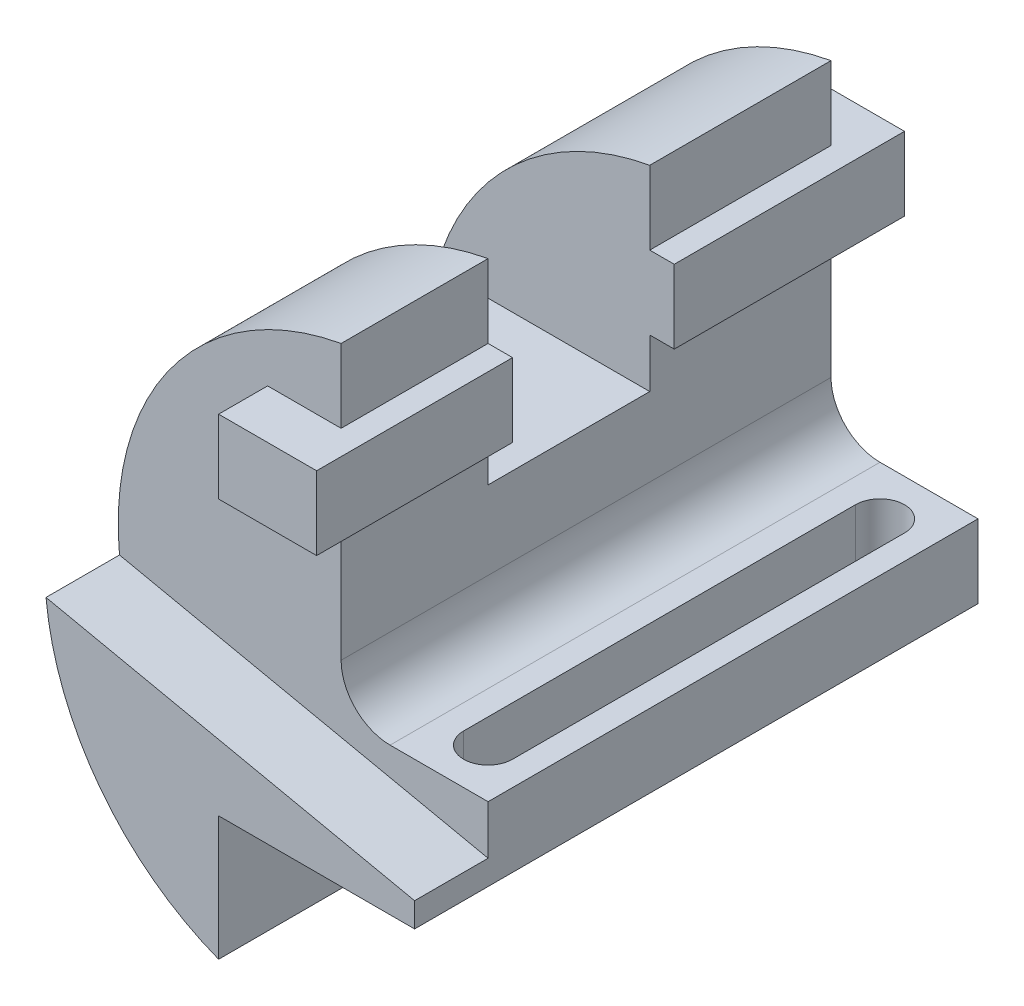
ISO-10303-21;
HEADER;
FILE_DESCRIPTION(('STEP AP214'),'2;1');
FILE_NAME('part.step','',(''),(''),'','','');
FILE_SCHEMA(('AUTOMOTIVE_DESIGN { 1 0 10303 214 1 1 1 1 }'));
ENDSEC;
DATA;
#1=APPLICATION_CONTEXT('core data for automotive mechanical design processes');
#2=APPLICATION_PROTOCOL_DEFINITION('international standard','automotive_design',2000,#1);
#3=PRODUCT_CONTEXT('',#1,'mechanical');
#4=PRODUCT('Part','Part','',(#3));
#5=PRODUCT_RELATED_PRODUCT_CATEGORY('part','',(#4));
#6=PRODUCT_DEFINITION_FORMATION('','',#4);
#7=PRODUCT_DEFINITION_CONTEXT('part definition',#1,'design');
#8=PRODUCT_DEFINITION('design','',#6,#7);
#9=PRODUCT_DEFINITION_SHAPE('','',#8);
#10=(LENGTH_UNIT() NAMED_UNIT(*) SI_UNIT(.MILLI.,.METRE.));
#11=(NAMED_UNIT(*) PLANE_ANGLE_UNIT() SI_UNIT($,.RADIAN.));
#12=(NAMED_UNIT(*) SI_UNIT($,.STERADIAN.) SOLID_ANGLE_UNIT());
#13=UNCERTAINTY_MEASURE_WITH_UNIT(LENGTH_MEASURE(1.E-05),#10,'distance_accuracy_value','');
#14=(GEOMETRIC_REPRESENTATION_CONTEXT(3) GLOBAL_UNCERTAINTY_ASSIGNED_CONTEXT((#13)) GLOBAL_UNIT_ASSIGNED_CONTEXT((#10,
#11,#12)) REPRESENTATION_CONTEXT('',''));
#15=CARTESIAN_POINT('',(0.,0.,0.));
#16=DIRECTION('',(0.,0.,1.));
#17=DIRECTION('',(1.,0.,0.));
#18=AXIS2_PLACEMENT_3D('',#15,#16,#17);
#19=CARTESIAN_POINT('',(-30.,15.,115.));
#20=DIRECTION('',(-1.,0.,0.));
#21=DIRECTION('',(0.,0.,1.));
#22=AXIS2_PLACEMENT_3D('',#19,#20,#21);
#23=PLANE('',#22);
#24=DIRECTION('',(0.,0.,1.));
#25=VECTOR('',#24,1.);
#26=CARTESIAN_POINT('',(-30.,66.,115.));
#27=LINE('',#26,#25);
#28=CARTESIAN_POINT('',(-30.,66.,70.));
#29=VERTEX_POINT('',#28);
#30=CARTESIAN_POINT('',(-30.,66.,100.));
#31=VERTEX_POINT('',#30);
#32=EDGE_CURVE('E333',#29,#31,#27,.T.);
#33=ORIENTED_EDGE('',*,*,#32,.F.);
#34=DIRECTION('',(0.,1.,0.));
#35=VECTOR('',#34,1.);
#36=CARTESIAN_POINT('',(-30.,15.,70.));
#37=LINE('',#36,#35);
#38=CARTESIAN_POINT('',(-30.,81.,70.));
#39=VERTEX_POINT('',#38);
#40=EDGE_CURVE('E284',#29,#39,#37,.T.);
#41=ORIENTED_EDGE('',*,*,#40,.T.);
#42=DIRECTION('',(0.,0.,-1.));
#43=VECTOR('',#42,1.);
#44=CARTESIAN_POINT('',(-30.,81.,115.));
#45=LINE('',#44,#43);
#46=CARTESIAN_POINT('',(-30.,81.,100.));
#47=VERTEX_POINT('',#46);
#48=EDGE_CURVE('E399',#47,#39,#45,.T.);
#49=ORIENTED_EDGE('',*,*,#48,.F.);
#50=DIRECTION('',(0.,1.,0.));
#51=VECTOR('',#50,1.);
#52=CARTESIAN_POINT('',(-30.,15.,100.));
#53=LINE('',#52,#51);
#54=EDGE_CURVE('E352',#31,#47,#53,.T.);
#55=ORIENTED_EDGE('',*,*,#54,.F.);
#56=EDGE_LOOP('',(#33,#41,#49,#55));
#57=FACE_BOUND('',#56,.T.);
#58=ADVANCED_FACE('F38',(#57),#23,.F.);
#59=CARTESIAN_POINT('',(-25.,51.,-10.));
#60=DIRECTION('',(0.,1.,0.));
#61=DIRECTION('',(0.,0.,1.));
#62=AXIS2_PLACEMENT_3D('',#59,#60,#61);
#63=PLANE('',#62);
#64=DIRECTION('',(0.,0.,-1.));
#65=VECTOR('',#64,1.);
#66=CARTESIAN_POINT('',(-30.,51.,115.));
#67=LINE('',#66,#65);
#68=CARTESIAN_POINT('',(-30.,51.,100.));
#69=VERTEX_POINT('',#68);
#70=CARTESIAN_POINT('',(-30.,51.,70.));
#71=VERTEX_POINT('',#70);
#72=EDGE_CURVE('E342',#69,#71,#67,.T.);
#73=ORIENTED_EDGE('',*,*,#72,.T.);
#74=DIRECTION('',(1.,0.,0.));
#75=VECTOR('',#74,1.);
#76=CARTESIAN_POINT('',(-25.,51.,70.));
#77=LINE('',#76,#75);
#78=CARTESIAN_POINT('',(-25.,51.,70.));
#79=VERTEX_POINT('',#78);
#80=EDGE_CURVE('E281',#71,#79,#77,.T.);
#81=ORIENTED_EDGE('',*,*,#80,.T.);
#82=DIRECTION('',(0.,0.,1.));
#83=VECTOR('',#82,1.);
#84=CARTESIAN_POINT('',(-25.,51.,-10.));
#85=LINE('',#84,#83);
#86=CARTESIAN_POINT('',(-25.,51.,110.));
#87=VERTEX_POINT('',#86);
#88=EDGE_CURVE('E329',#79,#87,#85,.T.);
#89=ORIENTED_EDGE('',*,*,#88,.T.);
#90=DIRECTION('',(-1.,0.,0.));
#91=VECTOR('',#90,1.);
#92=CARTESIAN_POINT('',(-25.,51.,110.));
#93=LINE('',#92,#91);
#94=CARTESIAN_POINT('',(-45.,51.,110.));
#95=VERTEX_POINT('',#94);
#96=EDGE_CURVE('E296',#87,#95,#93,.T.);
#97=ORIENTED_EDGE('',*,*,#96,.T.);
#98=DIRECTION('',(0.,0.,1.));
#99=VECTOR('',#98,1.);
#100=CARTESIAN_POINT('',(-45.,51.,-10.));
#101=LINE('',#100,#99);
#102=CARTESIAN_POINT('',(-45.,51.,100.));
#103=VERTEX_POINT('',#102);
#104=EDGE_CURVE('E325',#103,#95,#101,.T.);
#105=ORIENTED_EDGE('',*,*,#104,.F.);
#106=DIRECTION('',(-1.,0.,0.));
#107=VECTOR('',#106,1.);
#108=CARTESIAN_POINT('',(-20.,51.,100.));
#109=LINE('',#108,#107);
#110=EDGE_CURVE('E410',#69,#103,#109,.T.);
#111=ORIENTED_EDGE('',*,*,#110,.F.);
#112=EDGE_LOOP('',(#73,#81,#89,#97,#105,#111));
#113=FACE_BOUND('',#112,.T.);
#114=ADVANCED_FACE('F515',(#113),#63,.F.);
#115=CARTESIAN_POINT('',(-25.,66.,-10.));
#116=DIRECTION('',(0.,-1.,0.));
#117=DIRECTION('',(0.,0.,-1.));
#118=AXIS2_PLACEMENT_3D('',#115,#116,#117);
#119=PLANE('',#118);
#120=DIRECTION('',(0.,0.,1.));
#121=VECTOR('',#120,1.);
#122=CARTESIAN_POINT('',(-25.,66.,-10.));
#123=LINE('',#122,#121);
#124=CARTESIAN_POINT('',(-25.,66.,70.));
#125=VERTEX_POINT('',#124);
#126=CARTESIAN_POINT('',(-25.,66.,110.));
#127=VERTEX_POINT('',#126);
#128=EDGE_CURVE('E317',#125,#127,#123,.T.);
#129=ORIENTED_EDGE('',*,*,#128,.F.);
#130=DIRECTION('',(-1.,0.,0.));
#131=VECTOR('',#130,1.);
#132=CARTESIAN_POINT('',(-25.,66.,70.));
#133=LINE('',#132,#131);
#134=EDGE_CURVE('E278',#125,#29,#133,.T.);
#135=ORIENTED_EDGE('',*,*,#134,.T.);
#136=ORIENTED_EDGE('',*,*,#32,.T.);
#137=DIRECTION('',(1.,0.,0.));
#138=VECTOR('',#137,1.);
#139=CARTESIAN_POINT('',(-20.,66.,100.));
#140=LINE('',#139,#138);
#141=CARTESIAN_POINT('',(-45.,66.,100.));
#142=VERTEX_POINT('',#141);
#143=EDGE_CURVE('E404',#142,#31,#140,.T.);
#144=ORIENTED_EDGE('',*,*,#143,.F.);
#145=DIRECTION('',(0.,0.,1.));
#146=VECTOR('',#145,1.);
#147=CARTESIAN_POINT('',(-45.,66.,-10.));
#148=LINE('',#147,#146);
#149=CARTESIAN_POINT('',(-45.,66.,110.));
#150=VERTEX_POINT('',#149);
#151=EDGE_CURVE('E321',#142,#150,#148,.T.);
#152=ORIENTED_EDGE('',*,*,#151,.T.);
#153=DIRECTION('',(1.,0.,0.));
#154=VECTOR('',#153,1.);
#155=CARTESIAN_POINT('',(-25.,66.,110.));
#156=LINE('',#155,#154);
#157=EDGE_CURVE('E304',#150,#127,#156,.T.);
#158=ORIENTED_EDGE('',*,*,#157,.T.);
#159=EDGE_LOOP('',(#129,#135,#136,#144,#152,#158));
#160=FACE_BOUND('',#159,.T.);
#161=ADVANCED_FACE('F521',(#160),#119,.F.);
#162=CARTESIAN_POINT('',(-25.,66.,-10.));
#163=DIRECTION('',(-1.,0.,0.));
#164=DIRECTION('',(0.,0.,1.));
#165=AXIS2_PLACEMENT_3D('',#162,#163,#164);
#166=PLANE('',#165);
#167=ORIENTED_EDGE('',*,*,#88,.F.);
#168=DIRECTION('',(0.,1.,0.));
#169=VECTOR('',#168,1.);
#170=CARTESIAN_POINT('',(-25.,66.,70.));
#171=LINE('',#170,#169);
#172=EDGE_CURVE('E416',#79,#125,#171,.T.);
#173=ORIENTED_EDGE('',*,*,#172,.T.);
#174=ORIENTED_EDGE('',*,*,#128,.T.);
#175=DIRECTION('',(0.,-1.,0.));
#176=VECTOR('',#175,1.);
#177=CARTESIAN_POINT('',(-25.,66.,110.));
#178=LINE('',#177,#176);
#179=EDGE_CURVE('E300',#127,#87,#178,.T.);
#180=ORIENTED_EDGE('',*,*,#179,.T.);
#181=EDGE_LOOP('',(#167,#173,#174,#180));
#182=FACE_BOUND('',#181,.T.);
#183=ADVANCED_FACE('F529',(#182),#166,.F.);
#184=CARTESIAN_POINT('',(-30.,25.,100.));
#185=VERTEX_POINT('',#184);
#186=EDGE_CURVE('E353',#185,#69,#53,.T.);
#187=ORIENTED_EDGE('',*,*,#186,.F.);
#188=DIRECTION('',(0.,0.,-1.));
#189=VECTOR('',#188,1.);
#190=CARTESIAN_POINT('',(-30.,25.,0.));
#191=LINE('',#190,#189);
#192=CARTESIAN_POINT('',(-30.,25.,0.));
#193=VERTEX_POINT('',#192);
#194=EDGE_CURVE('E431',#185,#193,#191,.T.);
#195=ORIENTED_EDGE('',*,*,#194,.T.);
#196=DIRECTION('',(0.,1.,0.));
#197=VECTOR('',#196,1.);
#198=CARTESIAN_POINT('',(-30.,15.,0.));
#199=LINE('',#198,#197);
#200=CARTESIAN_POINT('',(-30.,51.,0.));
#201=VERTEX_POINT('',#200);
#202=EDGE_CURVE('E383',#193,#201,#199,.T.);
#203=ORIENTED_EDGE('',*,*,#202,.T.);
#204=CARTESIAN_POINT('',(-30.,51.,37.));
#205=VERTEX_POINT('',#204);
#206=EDGE_CURVE('E341',#205,#201,#67,.T.);
#207=ORIENTED_EDGE('',*,*,#206,.F.);
#208=DIRECTION('',(0.,-1.,0.));
#209=VECTOR('',#208,1.);
#210=CARTESIAN_POINT('',(-30.,15.,37.));
#211=LINE('',#210,#209);
#212=CARTESIAN_POINT('',(-30.,41.,37.));
#213=VERTEX_POINT('',#212);
#214=EDGE_CURVE('E272',#205,#213,#211,.T.);
#215=ORIENTED_EDGE('',*,*,#214,.T.);
#216=DIRECTION('',(0.,0.,1.));
#217=VECTOR('',#216,1.);
#218=CARTESIAN_POINT('',(-30.,41.,115.));
#219=LINE('',#218,#217);
#220=CARTESIAN_POINT('',(-30.,41.,70.));
#221=VERTEX_POINT('',#220);
#222=EDGE_CURVE('E293',#213,#221,#219,.T.);
#223=ORIENTED_EDGE('',*,*,#222,.T.);
#224=DIRECTION('',(0.,1.,0.));
#225=VECTOR('',#224,1.);
#226=CARTESIAN_POINT('',(-30.,15.,70.));
#227=LINE('',#226,#225);
#228=EDGE_CURVE('E287',#221,#71,#227,.T.);
#229=ORIENTED_EDGE('',*,*,#228,.T.);
#230=ORIENTED_EDGE('',*,*,#72,.F.);
#231=EDGE_LOOP('',(#187,#195,#203,#207,#215,#223,#229,#230));
#232=FACE_BOUND('',#231,.T.);
#233=ADVANCED_FACE('F437',(#232),#23,.F.);
#234=CARTESIAN_POINT('',(-30.,81.,37.));
#235=VERTEX_POINT('',#234);
#236=CARTESIAN_POINT('',(-30.,81.,0.));
#237=VERTEX_POINT('',#236);
#238=EDGE_CURVE('E398',#235,#237,#45,.T.);
#239=ORIENTED_EDGE('',*,*,#238,.F.);
#240=DIRECTION('',(0.,-1.,0.));
#241=VECTOR('',#240,1.);
#242=CARTESIAN_POINT('',(-30.,15.,37.));
#243=LINE('',#242,#241);
#244=CARTESIAN_POINT('',(-30.,66.,37.));
#245=VERTEX_POINT('',#244);
#246=EDGE_CURVE('E269',#235,#245,#243,.T.);
#247=ORIENTED_EDGE('',*,*,#246,.T.);
#248=CARTESIAN_POINT('',(-30.,66.,0.));
#249=VERTEX_POINT('',#248);
#250=EDGE_CURVE('E334',#249,#245,#27,.T.);
#251=ORIENTED_EDGE('',*,*,#250,.F.);
#252=EDGE_CURVE('E382',#249,#237,#199,.T.);
#253=ORIENTED_EDGE('',*,*,#252,.T.);
#254=EDGE_LOOP('',(#239,#247,#251,#253));
#255=FACE_BOUND('',#254,.T.);
#256=ADVANCED_FACE('F471',(#255),#23,.F.);
#257=CARTESIAN_POINT('',(-20.,26.4083339693685,0.));
#258=DIRECTION('',(0.,0.,1.));
#259=DIRECTION('',(1.,0.,0.));
#260=AXIS2_PLACEMENT_3D('',#257,#258,#259);
#261=PLANE('',#260);
#262=DIRECTION('',(-1.,0.,0.));
#263=VECTOR('',#262,1.);
#264=CARTESIAN_POINT('',(-20.,51.,0.));
#265=LINE('',#264,#263);
#266=CARTESIAN_POINT('',(-45.,51.,0.));
#267=VERTEX_POINT('',#266);
#268=EDGE_CURVE('E345',#201,#267,#265,.T.);
#269=ORIENTED_EDGE('',*,*,#268,.F.);
#270=ORIENTED_EDGE('',*,*,#202,.F.);
#271=CARTESIAN_POINT('',(-20.,25.,0.));
#272=DIRECTION('',(0.,0.,1.));
#273=DIRECTION('',(1.,0.,0.));
#274=AXIS2_PLACEMENT_3D('',#271,#272,#273);
#275=CIRCLE('',#274,10.);
#276=CARTESIAN_POINT('',(-20.,15.,0.));
#277=VERTEX_POINT('',#276);
#278=EDGE_CURVE('E46',#193,#277,#275,.T.);
#279=ORIENTED_EDGE('',*,*,#278,.T.);
#280=DIRECTION('',(-1.,0.,0.));
#281=VECTOR('',#280,1.);
#282=CARTESIAN_POINT('',(0.,15.,0.));
#283=LINE('',#282,#281);
#284=CARTESIAN_POINT('',(0.,15.,0.));
#285=VERTEX_POINT('',#284);
#286=EDGE_CURVE('E380',#285,#277,#283,.T.);
#287=ORIENTED_EDGE('',*,*,#286,.F.);
#288=DIRECTION('',(0.,1.,0.));
#289=VECTOR('',#288,1.);
#290=CARTESIAN_POINT('',(0.,0.,0.));
#291=LINE('',#290,#289);
#292=CARTESIAN_POINT('',(0.,0.,0.));
#293=VERTEX_POINT('',#292);
#294=EDGE_CURVE('E365',#293,#285,#291,.T.);
#295=ORIENTED_EDGE('',*,*,#294,.F.);
#296=DIRECTION('',(1.,0.,0.));
#297=VECTOR('',#296,1.);
#298=CARTESIAN_POINT('',(0.,0.,0.));
#299=LINE('',#298,#297);
#300=CARTESIAN_POINT('',(-40.,0.,0.));
#301=VERTEX_POINT('',#300);
#302=EDGE_CURVE('E371',#301,#293,#299,.T.);
#303=ORIENTED_EDGE('',*,*,#302,.F.);
#304=DIRECTION('',(0.,1.,0.));
#305=VECTOR('',#304,1.);
#306=CARTESIAN_POINT('',(-40.,0.,0.));
#307=LINE('',#306,#305);
#308=CARTESIAN_POINT('',(-40.,-25.3627969821569,0.));
#309=VERTEX_POINT('',#308);
#310=EDGE_CURVE('E387',#309,#301,#307,.T.);
#311=ORIENTED_EDGE('',*,*,#310,.F.);
#312=CARTESIAN_POINT('',(-20.,26.4083339693685,0.));
#313=DIRECTION('',(0.,0.,1.));
#314=DIRECTION('',(1.,0.,0.));
#315=AXIS2_PLACEMENT_3D('',#312,#313,#314);
#316=CIRCLE('',#315,55.5);
#317=EDGE_CURVE('E385',#237,#309,#316,.T.);
#318=ORIENTED_EDGE('',*,*,#317,.F.);
#319=ORIENTED_EDGE('',*,*,#252,.F.);
#320=DIRECTION('',(1.,0.,0.));
#321=VECTOR('',#320,1.);
#322=CARTESIAN_POINT('',(-20.,66.,0.));
#323=LINE('',#322,#321);
#324=CARTESIAN_POINT('',(-45.,66.,0.));
#325=VERTEX_POINT('',#324);
#326=EDGE_CURVE('E337',#325,#249,#323,.T.);
#327=ORIENTED_EDGE('',*,*,#326,.F.);
#328=DIRECTION('',(0.,1.,0.));
#329=VECTOR('',#328,1.);
#330=CARTESIAN_POINT('',(-45.,26.4083339693685,0.));
#331=LINE('',#330,#329);
#332=EDGE_CURVE('E339',#267,#325,#331,.T.);
#333=ORIENTED_EDGE('',*,*,#332,.F.);
#334=EDGE_LOOP('',(#269,#270,#279,#287,#295,#303,#311,#318,#319,#327,#333));
#335=FACE_BOUND('',#334,.T.);
#336=ADVANCED_FACE('F444',(#335),#261,.F.);
#337=CARTESIAN_POINT('',(-20.,26.4083339693685,100.));
#338=DIRECTION('',(0.,0.,1.));
#339=DIRECTION('',(1.,0.,0.));
#340=AXIS2_PLACEMENT_3D('',#337,#338,#339);
#341=PLANE('',#340);
#342=DIRECTION('',(-1.,0.,0.));
#343=VECTOR('',#342,1.);
#344=CARTESIAN_POINT('',(0.,15.,100.));
#345=LINE('',#344,#343);
#346=CARTESIAN_POINT('',(0.,15.,100.));
#347=VERTEX_POINT('',#346);
#348=CARTESIAN_POINT('',(-20.,15.,100.));
#349=VERTEX_POINT('',#348);
#350=EDGE_CURVE('E350',#347,#349,#345,.T.);
#351=ORIENTED_EDGE('',*,*,#350,.T.);
#352=CARTESIAN_POINT('',(-20.,25.,100.));
#353=DIRECTION('',(0.,0.,1.));
#354=DIRECTION('',(1.,0.,0.));
#355=AXIS2_PLACEMENT_3D('',#352,#353,#354);
#356=CIRCLE('',#355,10.);
#357=EDGE_CURVE('E12',#349,#185,#356,.F.);
#358=ORIENTED_EDGE('',*,*,#357,.T.);
#359=ORIENTED_EDGE('',*,*,#186,.T.);
#360=ORIENTED_EDGE('',*,*,#110,.T.);
#361=DIRECTION('',(0.,1.,0.));
#362=VECTOR('',#361,1.);
#363=CARTESIAN_POINT('',(-45.,26.4083339693685,100.));
#364=LINE('',#363,#362);
#365=EDGE_CURVE('E407',#103,#142,#364,.T.);
#366=ORIENTED_EDGE('',*,*,#365,.T.);
#367=ORIENTED_EDGE('',*,*,#143,.T.);
#368=ORIENTED_EDGE('',*,*,#54,.T.);
#369=CARTESIAN_POINT('',(-20.,26.4083339693685,100.));
#370=DIRECTION('',(0.,0.,1.));
#371=DIRECTION('',(1.,0.,0.));
#372=AXIS2_PLACEMENT_3D('',#369,#370,#371);
#373=CIRCLE('',#372,55.5);
#374=CARTESIAN_POINT('',(-75.2350441418964,20.9917022998936,100.));
#375=VERTEX_POINT('',#374);
#376=EDGE_CURVE('E355',#47,#375,#373,.T.);
#377=ORIENTED_EDGE('',*,*,#376,.T.);
#378=DIRECTION('',(0.978147600733806,-0.207911690817756,0.));
#379=VECTOR('',#378,1.);
#380=CARTESIAN_POINT('',(0.,5.,100.));
#381=LINE('',#380,#379);
#382=CARTESIAN_POINT('',(0.,5.,100.));
#383=VERTEX_POINT('',#382);
#384=EDGE_CURVE('E357',#375,#383,#381,.T.);
#385=ORIENTED_EDGE('',*,*,#384,.T.);
#386=DIRECTION('',(0.,1.,0.));
#387=VECTOR('',#386,1.);
#388=CARTESIAN_POINT('',(0.,5.,100.));
#389=LINE('',#388,#387);
#390=EDGE_CURVE('E348',#383,#347,#389,.T.);
#391=ORIENTED_EDGE('',*,*,#390,.T.);
#392=EDGE_LOOP('',(#351,#358,#359,#360,#366,#367,#368,#377,#385,#391));
#393=FACE_BOUND('',#392,.T.);
#394=ADVANCED_FACE('F496',(#393),#341,.T.);
#395=CARTESIAN_POINT('',(0.,15.,115.));
#396=DIRECTION('',(0.,-1.,0.));
#397=DIRECTION('',(1.,0.,0.));
#398=AXIS2_PLACEMENT_3D('',#395,#396,#397);
#399=PLANE('',#398);
#400=DIRECTION('',(0.,0.,1.));
#401=VECTOR('',#400,1.);
#402=CARTESIAN_POINT('',(-15.,15.,10.));
#403=LINE('',#402,#401);
#404=CARTESIAN_POINT('',(-15.,15.,10.));
#405=VERTEX_POINT('',#404);
#406=CARTESIAN_POINT('',(-15.,15.,90.));
#407=VERTEX_POINT('',#406);
#408=EDGE_CURVE('E239',#405,#407,#403,.T.);
#409=ORIENTED_EDGE('',*,*,#408,.F.);
#410=CARTESIAN_POINT('',(-10.,15.,10.));
#411=DIRECTION('',(0.,1.,0.));
#412=DIRECTION('',(-1.,0.,0.));
#413=AXIS2_PLACEMENT_3D('',#410,#411,#412);
#414=CIRCLE('',#413,5.);
#415=CARTESIAN_POINT('',(-5.,15.,10.));
#416=VERTEX_POINT('',#415);
#417=EDGE_CURVE('E244',#416,#405,#414,.T.);
#418=ORIENTED_EDGE('',*,*,#417,.F.);
#419=DIRECTION('',(0.,0.,-1.));
#420=VECTOR('',#419,1.);
#421=CARTESIAN_POINT('',(-5.,15.,10.));
#422=LINE('',#421,#420);
#423=CARTESIAN_POINT('',(-4.99999999999999,15.,90.));
#424=VERTEX_POINT('',#423);
#425=EDGE_CURVE('E248',#424,#416,#422,.T.);
#426=ORIENTED_EDGE('',*,*,#425,.F.);
#427=CARTESIAN_POINT('',(-9.99999999999999,15.,90.));
#428=DIRECTION('',(0.,1.,0.));
#429=DIRECTION('',(-1.,0.,0.));
#430=AXIS2_PLACEMENT_3D('',#427,#428,#429);
#431=CIRCLE('',#430,5.);
#432=EDGE_CURVE('E228',#407,#424,#431,.T.);
#433=ORIENTED_EDGE('',*,*,#432,.F.);
#434=EDGE_LOOP('',(#409,#418,#426,#433));
#435=FACE_BOUND('',#434,.T.);
#436=ORIENTED_EDGE('',*,*,#286,.T.);
#437=DIRECTION('',(0.,0.,-1.));
#438=VECTOR('',#437,1.);
#439=CARTESIAN_POINT('',(-20.,15.,100.));
#440=LINE('',#439,#438);
#441=EDGE_CURVE('E59',#277,#349,#440,.F.);
#442=ORIENTED_EDGE('',*,*,#441,.T.);
#443=ORIENTED_EDGE('',*,*,#350,.F.);
#444=DIRECTION('',(0.,0.,-1.));
#445=VECTOR('',#444,1.);
#446=CARTESIAN_POINT('',(0.,15.,115.));
#447=LINE('',#446,#445);
#448=EDGE_CURVE('E402',#347,#285,#447,.T.);
#449=ORIENTED_EDGE('',*,*,#448,.T.);
#450=EDGE_LOOP('',(#436,#442,#443,#449));
#451=FACE_BOUND('',#450,.T.);
#452=ADVANCED_FACE('F246',(#435,#451),#399,.F.);
#453=CARTESIAN_POINT('',(0.,0.,115.));
#454=DIRECTION('',(-1.,0.,0.));
#455=DIRECTION('',(0.,0.,1.));
#456=AXIS2_PLACEMENT_3D('',#453,#454,#455);
#457=PLANE('',#456);
#458=ORIENTED_EDGE('',*,*,#390,.F.);
#459=DIRECTION('',(0.,0.,1.));
#460=VECTOR('',#459,1.);
#461=CARTESIAN_POINT('',(0.,5.,100.));
#462=LINE('',#461,#460);
#463=CARTESIAN_POINT('',(0.,5.,115.));
#464=VERTEX_POINT('',#463);
#465=EDGE_CURVE('E362',#383,#464,#462,.T.);
#466=ORIENTED_EDGE('',*,*,#465,.T.);
#467=DIRECTION('',(0.,1.,0.));
#468=VECTOR('',#467,1.);
#469=CARTESIAN_POINT('',(0.,0.,115.));
#470=LINE('',#469,#468);
#471=CARTESIAN_POINT('',(0.,0.,115.));
#472=VERTEX_POINT('',#471);
#473=EDGE_CURVE('E367',#472,#464,#470,.T.);
#474=ORIENTED_EDGE('',*,*,#473,.F.);
#475=DIRECTION('',(0.,0.,-1.));
#476=VECTOR('',#475,1.);
#477=CARTESIAN_POINT('',(0.,0.,115.));
#478=LINE('',#477,#476);
#479=EDGE_CURVE('E377',#472,#293,#478,.T.);
#480=ORIENTED_EDGE('',*,*,#479,.T.);
#481=ORIENTED_EDGE('',*,*,#294,.T.);
#482=ORIENTED_EDGE('',*,*,#448,.F.);
#483=EDGE_LOOP('',(#458,#466,#474,#480,#481,#482));
#484=FACE_BOUND('',#483,.T.);
#485=ADVANCED_FACE('F499',(#484),#457,.F.);
#486=CARTESIAN_POINT('',(-20.,26.4083339693685,115.));
#487=DIRECTION('',(0.,0.,-1.));
#488=DIRECTION('',(-1.,0.,0.));
#489=AXIS2_PLACEMENT_3D('',#486,#487,#488);
#490=CYLINDRICAL_SURFACE('',#489,55.5);
#491=ORIENTED_EDGE('',*,*,#48,.T.);
#492=CARTESIAN_POINT('',(-20.,26.4083339693685,70.));
#493=DIRECTION('',(0.,0.,1.));
#494=DIRECTION('',(1.,0.,0.));
#495=AXIS2_PLACEMENT_3D('',#492,#493,#494);
#496=CIRCLE('',#495,55.5);
#497=CARTESIAN_POINT('',(-73.5474862383895,41.,70.));
#498=VERTEX_POINT('',#497);
#499=EDGE_CURVE('E290',#39,#498,#496,.T.);
#500=ORIENTED_EDGE('',*,*,#499,.T.);
#501=DIRECTION('',(0.,0.,-1.));
#502=VECTOR('',#501,1.);
#503=CARTESIAN_POINT('',(-73.5474862383895,41.,115.));
#504=LINE('',#503,#502);
#505=CARTESIAN_POINT('',(-73.5474862383895,41.,37.));
#506=VERTEX_POINT('',#505);
#507=EDGE_CURVE('E419',#498,#506,#504,.T.);
#508=ORIENTED_EDGE('',*,*,#507,.T.);
#509=CARTESIAN_POINT('',(-20.,26.4083339693685,37.));
#510=DIRECTION('',(0.,0.,-1.));
#511=DIRECTION('',(0.,1.,0.));
#512=AXIS2_PLACEMENT_3D('',#509,#510,#511);
#513=CIRCLE('',#512,55.5);
#514=EDGE_CURVE('E275',#506,#235,#513,.T.);
#515=ORIENTED_EDGE('',*,*,#514,.T.);
#516=ORIENTED_EDGE('',*,*,#238,.T.);
#517=ORIENTED_EDGE('',*,*,#317,.T.);
#518=DIRECTION('',(0.,0.,-1.));
#519=VECTOR('',#518,1.);
#520=CARTESIAN_POINT('',(-40.,-25.3627969821569,115.));
#521=LINE('',#520,#519);
#522=CARTESIAN_POINT('',(-40.,-25.3627969821569,115.));
#523=VERTEX_POINT('',#522);
#524=EDGE_CURVE('E395',#523,#309,#521,.T.);
#525=ORIENTED_EDGE('',*,*,#524,.F.);
#526=CARTESIAN_POINT('',(-20.,26.4083339693685,115.));
#527=DIRECTION('',(0.,0.,1.));
#528=DIRECTION('',(1.,0.,0.));
#529=AXIS2_PLACEMENT_3D('',#526,#527,#528);
#530=CIRCLE('',#529,55.5);
#531=CARTESIAN_POINT('',(-75.2350441418964,20.9917022998936,115.));
#532=VERTEX_POINT('',#531);
#533=EDGE_CURVE('E370',#532,#523,#530,.T.);
#534=ORIENTED_EDGE('',*,*,#533,.F.);
#535=DIRECTION('',(0.,0.,1.));
#536=VECTOR('',#535,1.);
#537=CARTESIAN_POINT('',(-75.2350441418964,20.9917022998936,100.));
#538=LINE('',#537,#536);
#539=EDGE_CURVE('E360',#375,#532,#538,.T.);
#540=ORIENTED_EDGE('',*,*,#539,.F.);
#541=ORIENTED_EDGE('',*,*,#376,.F.);
#542=EDGE_LOOP('',(#491,#500,#508,#515,#516,#517,#525,#534,#540,#541));
#543=FACE_BOUND('',#542,.T.);
#544=ADVANCED_FACE('F477',(#543),#490,.T.);
#545=CARTESIAN_POINT('',(-40.,0.,115.));
#546=DIRECTION('',(-1.,0.,0.));
#547=DIRECTION('',(0.,-1.,0.));
#548=AXIS2_PLACEMENT_3D('',#545,#546,#547);
#549=PLANE('',#548);
#550=ORIENTED_EDGE('',*,*,#310,.T.);
#551=DIRECTION('',(0.,0.,-1.));
#552=VECTOR('',#551,1.);
#553=CARTESIAN_POINT('',(-40.,0.,115.));
#554=LINE('',#553,#552);
#555=CARTESIAN_POINT('',(-40.,0.,115.));
#556=VERTEX_POINT('',#555);
#557=EDGE_CURVE('E392',#556,#301,#554,.T.);
#558=ORIENTED_EDGE('',*,*,#557,.F.);
#559=DIRECTION('',(0.,1.,0.));
#560=VECTOR('',#559,1.);
#561=CARTESIAN_POINT('',(-40.,0.,115.));
#562=LINE('',#561,#560);
#563=EDGE_CURVE('E373',#523,#556,#562,.T.);
#564=ORIENTED_EDGE('',*,*,#563,.F.);
#565=ORIENTED_EDGE('',*,*,#524,.T.);
#566=EDGE_LOOP('',(#550,#558,#564,#565));
#567=FACE_BOUND('',#566,.T.);
#568=ADVANCED_FACE('F481',(#567),#549,.F.);
#569=CARTESIAN_POINT('',(0.,0.,115.));
#570=DIRECTION('',(0.,1.,0.));
#571=DIRECTION('',(0.,0.,1.));
#572=AXIS2_PLACEMENT_3D('',#569,#570,#571);
#573=PLANE('',#572);
#574=DIRECTION('',(0.,0.,-1.));
#575=VECTOR('',#574,1.);
#576=CARTESIAN_POINT('',(-4.99999999999999,0.,115.));
#577=LINE('',#576,#575);
#578=CARTESIAN_POINT('',(-4.99999999999999,0.,90.));
#579=VERTEX_POINT('',#578);
#580=CARTESIAN_POINT('',(-5.,0.,10.));
#581=VERTEX_POINT('',#580);
#582=EDGE_CURVE('E425',#579,#581,#577,.T.);
#583=ORIENTED_EDGE('',*,*,#582,.T.);
#584=CARTESIAN_POINT('',(-10.,0.,10.));
#585=DIRECTION('',(0.,1.,0.));
#586=DIRECTION('',(0.,0.,1.));
#587=AXIS2_PLACEMENT_3D('',#584,#585,#586);
#588=CIRCLE('',#587,5.);
#589=CARTESIAN_POINT('',(-15.,0.,10.));
#590=VERTEX_POINT('',#589);
#591=EDGE_CURVE('E428',#581,#590,#588,.T.);
#592=ORIENTED_EDGE('',*,*,#591,.T.);
#593=DIRECTION('',(0.,0.,1.));
#594=VECTOR('',#593,1.);
#595=CARTESIAN_POINT('',(-15.,0.,115.));
#596=LINE('',#595,#594);
#597=CARTESIAN_POINT('',(-15.,0.,90.));
#598=VERTEX_POINT('',#597);
#599=EDGE_CURVE('E422',#590,#598,#596,.T.);
#600=ORIENTED_EDGE('',*,*,#599,.T.);
#601=CARTESIAN_POINT('',(-9.99999999999999,0.,90.));
#602=DIRECTION('',(0.,1.,0.));
#603=DIRECTION('',(0.,0.,1.));
#604=AXIS2_PLACEMENT_3D('',#601,#602,#603);
#605=CIRCLE('',#604,5.);
#606=EDGE_CURVE('E231',#598,#579,#605,.T.);
#607=ORIENTED_EDGE('',*,*,#606,.T.);
#608=EDGE_LOOP('',(#583,#592,#600,#607));
#609=FACE_BOUND('',#608,.T.);
#610=ORIENTED_EDGE('',*,*,#302,.T.);
#611=ORIENTED_EDGE('',*,*,#479,.F.);
#612=DIRECTION('',(1.,0.,0.));
#613=VECTOR('',#612,1.);
#614=CARTESIAN_POINT('',(0.,0.,115.));
#615=LINE('',#614,#613);
#616=EDGE_CURVE('E375',#556,#472,#615,.T.);
#617=ORIENTED_EDGE('',*,*,#616,.F.);
#618=ORIENTED_EDGE('',*,*,#557,.T.);
#619=EDGE_LOOP('',(#610,#611,#617,#618));
#620=FACE_BOUND('',#619,.T.);
#621=ADVANCED_FACE('F503',(#609,#620),#573,.F.);
#622=CARTESIAN_POINT('',(-20.,26.4083339693685,115.));
#623=DIRECTION('',(0.,0.,1.));
#624=DIRECTION('',(1.,0.,0.));
#625=AXIS2_PLACEMENT_3D('',#622,#623,#624);
#626=PLANE('',#625);
#627=DIRECTION('',(0.978147600733806,-0.207911690817756,0.));
#628=VECTOR('',#627,1.);
#629=CARTESIAN_POINT('',(0.,5.,115.));
#630=LINE('',#629,#628);
#631=EDGE_CURVE('E347',#532,#464,#630,.T.);
#632=ORIENTED_EDGE('',*,*,#631,.F.);
#633=ORIENTED_EDGE('',*,*,#533,.T.);
#634=ORIENTED_EDGE('',*,*,#563,.T.);
#635=ORIENTED_EDGE('',*,*,#616,.T.);
#636=ORIENTED_EDGE('',*,*,#473,.T.);
#637=EDGE_LOOP('',(#632,#633,#634,#635,#636));
#638=FACE_BOUND('',#637,.T.);
#639=ADVANCED_FACE('F486',(#638),#626,.T.);
#640=CARTESIAN_POINT('',(0.,5.,100.));
#641=DIRECTION('',(-0.207911690817756,-0.978147600733806,0.));
#642=DIRECTION('',(0.978147600733806,-0.207911690817756,0.));
#643=AXIS2_PLACEMENT_3D('',#640,#641,#642);
#644=PLANE('',#643);
#645=ORIENTED_EDGE('',*,*,#631,.T.);
#646=ORIENTED_EDGE('',*,*,#465,.F.);
#647=ORIENTED_EDGE('',*,*,#384,.F.);
#648=ORIENTED_EDGE('',*,*,#539,.T.);
#649=EDGE_LOOP('',(#645,#646,#647,#648));
#650=FACE_BOUND('',#649,.T.);
#651=ADVANCED_FACE('F493',(#650),#644,.F.);
#652=CARTESIAN_POINT('',(-25.,51.,-10.));
#653=VERTEX_POINT('',#652);
#654=CARTESIAN_POINT('',(-25.,51.,37.));
#655=VERTEX_POINT('',#654);
#656=EDGE_CURVE('E330',#653,#655,#85,.T.);
#657=ORIENTED_EDGE('',*,*,#656,.T.);
#658=DIRECTION('',(-1.,0.,0.));
#659=VECTOR('',#658,1.);
#660=CARTESIAN_POINT('',(-25.,51.,37.));
#661=LINE('',#660,#659);
#662=EDGE_CURVE('E266',#655,#205,#661,.T.);
#663=ORIENTED_EDGE('',*,*,#662,.T.);
#664=ORIENTED_EDGE('',*,*,#206,.T.);
#665=ORIENTED_EDGE('',*,*,#268,.T.);
#666=CARTESIAN_POINT('',(-45.,51.,-10.));
#667=VERTEX_POINT('',#666);
#668=EDGE_CURVE('E326',#667,#267,#101,.T.);
#669=ORIENTED_EDGE('',*,*,#668,.F.);
#670=DIRECTION('',(-1.,0.,0.));
#671=VECTOR('',#670,1.);
#672=CARTESIAN_POINT('',(-25.,51.,-10.));
#673=LINE('',#672,#671);
#674=EDGE_CURVE('E311',#653,#667,#673,.T.);
#675=ORIENTED_EDGE('',*,*,#674,.F.);
#676=EDGE_LOOP('',(#657,#663,#664,#665,#669,#675));
#677=FACE_BOUND('',#676,.T.);
#678=ADVANCED_FACE('F449',(#677),#63,.F.);
#679=CARTESIAN_POINT('',(-45.,66.,-10.));
#680=DIRECTION('',(1.,0.,0.));
#681=DIRECTION('',(0.,0.,-1.));
#682=AXIS2_PLACEMENT_3D('',#679,#680,#681);
#683=PLANE('',#682);
#684=ORIENTED_EDGE('',*,*,#668,.T.);
#685=ORIENTED_EDGE('',*,*,#332,.T.);
#686=CARTESIAN_POINT('',(-45.,66.,-10.));
#687=VERTEX_POINT('',#686);
#688=EDGE_CURVE('E322',#687,#325,#148,.T.);
#689=ORIENTED_EDGE('',*,*,#688,.F.);
#690=DIRECTION('',(0.,1.,0.));
#691=VECTOR('',#690,1.);
#692=CARTESIAN_POINT('',(-45.,66.,-10.));
#693=LINE('',#692,#691);
#694=EDGE_CURVE('E313',#667,#687,#693,.T.);
#695=ORIENTED_EDGE('',*,*,#694,.F.);
#696=EDGE_LOOP('',(#684,#685,#689,#695));
#697=FACE_BOUND('',#696,.T.);
#698=ADVANCED_FACE('F452',(#697),#683,.F.);
#699=ORIENTED_EDGE('',*,*,#250,.T.);
#700=DIRECTION('',(1.,0.,0.));
#701=VECTOR('',#700,1.);
#702=CARTESIAN_POINT('',(-25.,66.,37.));
#703=LINE('',#702,#701);
#704=CARTESIAN_POINT('',(-25.,66.,37.));
#705=VERTEX_POINT('',#704);
#706=EDGE_CURVE('E261',#245,#705,#703,.T.);
#707=ORIENTED_EDGE('',*,*,#706,.T.);
#708=CARTESIAN_POINT('',(-25.,66.,-10.));
#709=VERTEX_POINT('',#708);
#710=EDGE_CURVE('E318',#709,#705,#123,.T.);
#711=ORIENTED_EDGE('',*,*,#710,.F.);
#712=DIRECTION('',(1.,0.,0.));
#713=VECTOR('',#712,1.);
#714=CARTESIAN_POINT('',(-25.,66.,-10.));
#715=LINE('',#714,#713);
#716=EDGE_CURVE('E315',#687,#709,#715,.T.);
#717=ORIENTED_EDGE('',*,*,#716,.F.);
#718=ORIENTED_EDGE('',*,*,#688,.T.);
#719=ORIENTED_EDGE('',*,*,#326,.T.);
#720=EDGE_LOOP('',(#699,#707,#711,#717,#718,#719));
#721=FACE_BOUND('',#720,.T.);
#722=ADVANCED_FACE('F465',(#721),#119,.F.);
#723=ORIENTED_EDGE('',*,*,#710,.T.);
#724=DIRECTION('',(0.,-1.,0.));
#725=VECTOR('',#724,1.);
#726=CARTESIAN_POINT('',(-25.,66.,37.));
#727=LINE('',#726,#725);
#728=EDGE_CURVE('E413',#705,#655,#727,.T.);
#729=ORIENTED_EDGE('',*,*,#728,.T.);
#730=ORIENTED_EDGE('',*,*,#656,.F.);
#731=DIRECTION('',(0.,-1.,0.));
#732=VECTOR('',#731,1.);
#733=CARTESIAN_POINT('',(-25.,66.,-10.));
#734=LINE('',#733,#732);
#735=EDGE_CURVE('E303',#709,#653,#734,.T.);
#736=ORIENTED_EDGE('',*,*,#735,.F.);
#737=EDGE_LOOP('',(#723,#729,#730,#736));
#738=FACE_BOUND('',#737,.T.);
#739=ADVANCED_FACE('F461',(#738),#166,.F.);
#740=ORIENTED_EDGE('',*,*,#365,.F.);
#741=ORIENTED_EDGE('',*,*,#104,.T.);
#742=DIRECTION('',(0.,1.,0.));
#743=VECTOR('',#742,1.);
#744=CARTESIAN_POINT('',(-45.,66.,110.));
#745=LINE('',#744,#743);
#746=EDGE_CURVE('E299',#95,#150,#745,.T.);
#747=ORIENTED_EDGE('',*,*,#746,.T.);
#748=ORIENTED_EDGE('',*,*,#151,.F.);
#749=EDGE_LOOP('',(#740,#741,#747,#748));
#750=FACE_BOUND('',#749,.T.);
#751=ADVANCED_FACE('F543',(#750),#683,.F.);
#752=CARTESIAN_POINT('',(0.,0.,-10.));
#753=DIRECTION('',(0.,0.,-1.));
#754=DIRECTION('',(-1.,0.,0.));
#755=AXIS2_PLACEMENT_3D('',#752,#753,#754);
#756=PLANE('',#755);
#757=ORIENTED_EDGE('',*,*,#735,.T.);
#758=ORIENTED_EDGE('',*,*,#674,.T.);
#759=ORIENTED_EDGE('',*,*,#694,.T.);
#760=ORIENTED_EDGE('',*,*,#716,.T.);
#761=EDGE_LOOP('',(#757,#758,#759,#760));
#762=FACE_BOUND('',#761,.T.);
#763=ADVANCED_FACE('F456',(#762),#756,.T.);
#764=CARTESIAN_POINT('',(-20.,26.4083339693685,110.));
#765=DIRECTION('',(0.,0.,1.));
#766=DIRECTION('',(1.,0.,0.));
#767=AXIS2_PLACEMENT_3D('',#764,#765,#766);
#768=PLANE('',#767);
#769=ORIENTED_EDGE('',*,*,#179,.F.);
#770=ORIENTED_EDGE('',*,*,#157,.F.);
#771=ORIENTED_EDGE('',*,*,#746,.F.);
#772=ORIENTED_EDGE('',*,*,#96,.F.);
#773=EDGE_LOOP('',(#769,#770,#771,#772));
#774=FACE_BOUND('',#773,.T.);
#775=ADVANCED_FACE('F623',(#774),#768,.T.);
#776=CARTESIAN_POINT('',(-75.5,41.,70.));
#777=DIRECTION('',(0.,-1.,0.));
#778=DIRECTION('',(0.,0.,-1.));
#779=AXIS2_PLACEMENT_3D('',#776,#777,#778);
#780=PLANE('',#779);
#781=DIRECTION('',(1.,0.,0.));
#782=VECTOR('',#781,1.);
#783=CARTESIAN_POINT('',(-75.5,41.,37.));
#784=LINE('',#783,#782);
#785=EDGE_CURVE('E258',#506,#213,#784,.T.);
#786=ORIENTED_EDGE('',*,*,#785,.F.);
#787=ORIENTED_EDGE('',*,*,#507,.F.);
#788=DIRECTION('',(1.,0.,0.));
#789=VECTOR('',#788,1.);
#790=CARTESIAN_POINT('',(-75.5,41.,70.));
#791=LINE('',#790,#789);
#792=EDGE_CURVE('E255',#498,#221,#791,.T.);
#793=ORIENTED_EDGE('',*,*,#792,.T.);
#794=ORIENTED_EDGE('',*,*,#222,.F.);
#795=EDGE_LOOP('',(#786,#787,#793,#794));
#796=FACE_BOUND('',#795,.T.);
#797=ADVANCED_FACE('F630',(#796),#780,.F.);
#798=CARTESIAN_POINT('',(-75.5,81.,70.));
#799=DIRECTION('',(0.,0.,1.));
#800=DIRECTION('',(1.,0.,0.));
#801=AXIS2_PLACEMENT_3D('',#798,#799,#800);
#802=PLANE('',#801);
#803=ORIENTED_EDGE('',*,*,#40,.F.);
#804=ORIENTED_EDGE('',*,*,#134,.F.);
#805=ORIENTED_EDGE('',*,*,#172,.F.);
#806=ORIENTED_EDGE('',*,*,#80,.F.);
#807=ORIENTED_EDGE('',*,*,#228,.F.);
#808=ORIENTED_EDGE('',*,*,#792,.F.);
#809=ORIENTED_EDGE('',*,*,#499,.F.);
#810=EDGE_LOOP('',(#803,#804,#805,#806,#807,#808,#809));
#811=FACE_BOUND('',#810,.T.);
#812=ADVANCED_FACE('F682',(#811),#802,.F.);
#813=CARTESIAN_POINT('',(-75.5,81.,37.));
#814=DIRECTION('',(0.,0.,-1.));
#815=DIRECTION('',(0.,1.,0.));
#816=AXIS2_PLACEMENT_3D('',#813,#814,#815);
#817=PLANE('',#816);
#818=ORIENTED_EDGE('',*,*,#785,.T.);
#819=ORIENTED_EDGE('',*,*,#214,.F.);
#820=ORIENTED_EDGE('',*,*,#662,.F.);
#821=ORIENTED_EDGE('',*,*,#728,.F.);
#822=ORIENTED_EDGE('',*,*,#706,.F.);
#823=ORIENTED_EDGE('',*,*,#246,.F.);
#824=ORIENTED_EDGE('',*,*,#514,.F.);
#825=EDGE_LOOP('',(#818,#819,#820,#821,#822,#823,#824));
#826=FACE_BOUND('',#825,.T.);
#827=ADVANCED_FACE('F463',(#826),#817,.F.);
#828=CARTESIAN_POINT('',(-9.99999999999999,-25.3627969821569,10.));
#829=DIRECTION('',(0.,1.,0.));
#830=DIRECTION('',(-1.,0.,0.));
#831=AXIS2_PLACEMENT_3D('',#828,#829,#830);
#832=CYLINDRICAL_SURFACE('',#831,5.);
#833=DIRECTION('',(0.,1.,0.));
#834=VECTOR('',#833,1.);
#835=CARTESIAN_POINT('',(-4.99999999999999,-25.3627969821569,10.));
#836=LINE('',#835,#834);
#837=EDGE_CURVE('E253',#581,#416,#836,.T.);
#838=ORIENTED_EDGE('',*,*,#837,.T.);
#839=ORIENTED_EDGE('',*,*,#417,.T.);
#840=DIRECTION('',(0.,1.,0.));
#841=VECTOR('',#840,1.);
#842=CARTESIAN_POINT('',(-15.,-25.3627969821569,10.));
#843=LINE('',#842,#841);
#844=EDGE_CURVE('E235',#590,#405,#843,.T.);
#845=ORIENTED_EDGE('',*,*,#844,.F.);
#846=ORIENTED_EDGE('',*,*,#591,.F.);
#847=EDGE_LOOP('',(#838,#839,#845,#846));
#848=FACE_BOUND('',#847,.T.);
#849=ADVANCED_FACE('F700',(#848),#832,.F.);
#850=CARTESIAN_POINT('',(-4.99999999999999,-25.3627969821569,10.));
#851=DIRECTION('',(1.,0.,0.));
#852=DIRECTION('',(0.,1.,0.));
#853=AXIS2_PLACEMENT_3D('',#850,#851,#852);
#854=PLANE('',#853);
#855=DIRECTION('',(0.,1.,0.));
#856=VECTOR('',#855,1.);
#857=CARTESIAN_POINT('',(-4.99999999999999,-25.3627969821569,90.));
#858=LINE('',#857,#856);
#859=EDGE_CURVE('E234',#579,#424,#858,.T.);
#860=ORIENTED_EDGE('',*,*,#859,.T.);
#861=ORIENTED_EDGE('',*,*,#425,.T.);
#862=ORIENTED_EDGE('',*,*,#837,.F.);
#863=ORIENTED_EDGE('',*,*,#582,.F.);
#864=EDGE_LOOP('',(#860,#861,#862,#863));
#865=FACE_BOUND('',#864,.T.);
#866=ADVANCED_FACE('F713',(#865),#854,.F.);
#867=CARTESIAN_POINT('',(-9.99999999999998,-25.3627969821569,90.));
#868=DIRECTION('',(0.,1.,0.));
#869=DIRECTION('',(-1.,0.,0.));
#870=AXIS2_PLACEMENT_3D('',#867,#868,#869);
#871=CYLINDRICAL_SURFACE('',#870,5.);
#872=DIRECTION('',(0.,1.,0.));
#873=VECTOR('',#872,1.);
#874=CARTESIAN_POINT('',(-15.,-25.3627969821569,90.));
#875=LINE('',#874,#873);
#876=EDGE_CURVE('E223',#598,#407,#875,.T.);
#877=ORIENTED_EDGE('',*,*,#876,.T.);
#878=ORIENTED_EDGE('',*,*,#432,.T.);
#879=ORIENTED_EDGE('',*,*,#859,.F.);
#880=ORIENTED_EDGE('',*,*,#606,.F.);
#881=EDGE_LOOP('',(#877,#878,#879,#880));
#882=FACE_BOUND('',#881,.T.);
#883=ADVANCED_FACE('F225',(#882),#871,.F.);
#884=CARTESIAN_POINT('',(-15.,-25.3627969821569,10.));
#885=DIRECTION('',(-1.,0.,0.));
#886=DIRECTION('',(0.,0.,1.));
#887=AXIS2_PLACEMENT_3D('',#884,#885,#886);
#888=PLANE('',#887);
#889=ORIENTED_EDGE('',*,*,#844,.T.);
#890=ORIENTED_EDGE('',*,*,#408,.T.);
#891=ORIENTED_EDGE('',*,*,#876,.F.);
#892=ORIENTED_EDGE('',*,*,#599,.F.);
#893=EDGE_LOOP('',(#889,#890,#891,#892));
#894=FACE_BOUND('',#893,.T.);
#895=ADVANCED_FACE('F240',(#894),#888,.F.);
#896=CARTESIAN_POINT('',(-20.,25.,115.));
#897=DIRECTION('',(0.,0.,1.));
#898=DIRECTION('',(1.,0.,0.));
#899=AXIS2_PLACEMENT_3D('',#896,#897,#898);
#900=CYLINDRICAL_SURFACE('',#899,10.);
#901=ORIENTED_EDGE('',*,*,#357,.F.);
#902=ORIENTED_EDGE('',*,*,#441,.F.);
#903=ORIENTED_EDGE('',*,*,#278,.F.);
#904=ORIENTED_EDGE('',*,*,#194,.F.);
#905=EDGE_LOOP('',(#901,#902,#903,#904));
#906=FACE_BOUND('',#905,.T.);
#907=ADVANCED_FACE('F40',(#906),#900,.F.);
#908=CLOSED_SHELL('',(#58,#114,#161,#183,#233,#256,#336,#394,#452,#485,#544,#568,#621,#639,#651,
#678,#698,#722,#739,#751,#763,#775,#797,#812,#827,#849,#866,#883,#895,#907));
#909=MANIFOLD_SOLID_BREP('B2',#908);
#910=ADVANCED_BREP_SHAPE_REPRESENTATION('',(#18,#909),#14);
#911=SHAPE_DEFINITION_REPRESENTATION(#9,#910);
ENDSEC;
END-ISO-10303-21;
